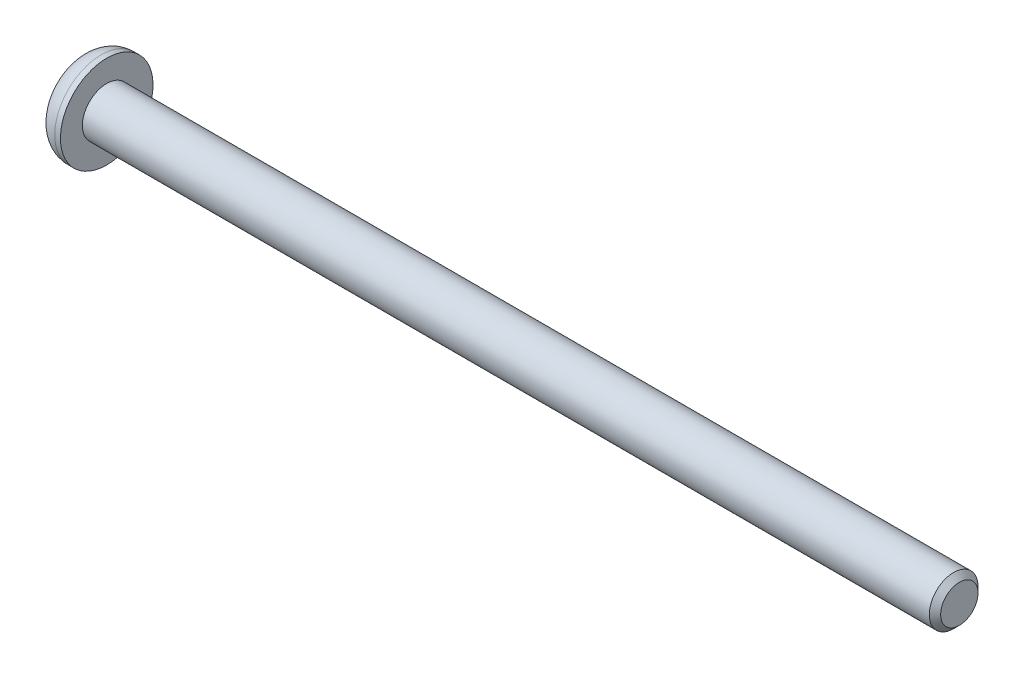
ISO-10303-21;
HEADER;
FILE_DESCRIPTION(('STEP AP214'),'2;1');
FILE_NAME('part.step','',(''),(''),'','','');
FILE_SCHEMA(('AUTOMOTIVE_DESIGN { 1 0 10303 214 1 1 1 1 }'));
ENDSEC;
DATA;
#1=APPLICATION_CONTEXT('core data for automotive mechanical design processes');
#2=APPLICATION_PROTOCOL_DEFINITION('international standard','automotive_design',2000,#1);
#3=PRODUCT_CONTEXT('',#1,'mechanical');
#4=PRODUCT('Part','Part','',(#3));
#5=PRODUCT_RELATED_PRODUCT_CATEGORY('part','',(#4));
#6=PRODUCT_DEFINITION_FORMATION('','',#4);
#7=PRODUCT_DEFINITION_CONTEXT('part definition',#1,'design');
#8=PRODUCT_DEFINITION('design','',#6,#7);
#9=PRODUCT_DEFINITION_SHAPE('','',#8);
#10=(LENGTH_UNIT() NAMED_UNIT(*) SI_UNIT(.MILLI.,.METRE.));
#11=(NAMED_UNIT(*) PLANE_ANGLE_UNIT() SI_UNIT($,.RADIAN.));
#12=(NAMED_UNIT(*) SI_UNIT($,.STERADIAN.) SOLID_ANGLE_UNIT());
#13=UNCERTAINTY_MEASURE_WITH_UNIT(LENGTH_MEASURE(1.E-05),#10,'distance_accuracy_value','');
#14=(GEOMETRIC_REPRESENTATION_CONTEXT(3) GLOBAL_UNCERTAINTY_ASSIGNED_CONTEXT((#13)) GLOBAL_UNIT_ASSIGNED_CONTEXT((#10,
#11,#12)) REPRESENTATION_CONTEXT('',''));
#15=CARTESIAN_POINT('',(0.,0.,0.));
#16=DIRECTION('',(0.,0.,1.));
#17=DIRECTION('',(1.,0.,0.));
#18=AXIS2_PLACEMENT_3D('',#15,#16,#17);
#19=CARTESIAN_POINT('',(0.,0.,0.));
#20=DIRECTION('',(1.,0.,0.));
#21=DIRECTION('',(0.,1.,0.));
#22=AXIS2_PLACEMENT_3D('',#19,#20,#21);
#23=PLANE('',#22);
#24=DIRECTION('',(0.,-0.5,-0.866025403784439));
#25=VECTOR('',#24,1.);
#26=CARTESIAN_POINT('',(0.,1.64544826719043,0.));
#27=LINE('',#26,#25);
#28=CARTESIAN_POINT('',(0.,1.64544826719043,0.));
#29=VERTEX_POINT('',#28);
#30=CARTESIAN_POINT('',(0.,0.822724133595217,-1.425));
#31=VERTEX_POINT('',#30);
#32=EDGE_CURVE('E138',#29,#31,#27,.T.);
#33=ORIENTED_EDGE('',*,*,#32,.F.);
#34=DIRECTION('',(0.,0.5,-0.866025403784439));
#35=VECTOR('',#34,1.);
#36=CARTESIAN_POINT('',(0.,0.822724133595217,1.425));
#37=LINE('',#36,#35);
#38=CARTESIAN_POINT('',(0.,0.822724133595217,1.425));
#39=VERTEX_POINT('',#38);
#40=EDGE_CURVE('E58',#39,#29,#37,.T.);
#41=ORIENTED_EDGE('',*,*,#40,.F.);
#42=DIRECTION('',(0.,1.,0.));
#43=VECTOR('',#42,1.);
#44=CARTESIAN_POINT('',(0.,-0.822724133595218,1.425));
#45=LINE('',#44,#43);
#46=CARTESIAN_POINT('',(0.,-0.822724133595218,1.425));
#47=VERTEX_POINT('',#46);
#48=EDGE_CURVE('E151',#47,#39,#45,.T.);
#49=ORIENTED_EDGE('',*,*,#48,.F.);
#50=DIRECTION('',(0.,0.5,0.866025403784439));
#51=VECTOR('',#50,1.);
#52=CARTESIAN_POINT('',(0.,-1.64544826719043,0.));
#53=LINE('',#52,#51);
#54=CARTESIAN_POINT('',(0.,-1.64544826719043,0.));
#55=VERTEX_POINT('',#54);
#56=EDGE_CURVE('E148',#55,#47,#53,.T.);
#57=ORIENTED_EDGE('',*,*,#56,.F.);
#58=DIRECTION('',(0.,-0.5,0.866025403784438));
#59=VECTOR('',#58,1.);
#60=CARTESIAN_POINT('',(0.,-0.822724133595217,-1.425));
#61=LINE('',#60,#59);
#62=CARTESIAN_POINT('',(0.,-0.822724133595217,-1.425));
#63=VERTEX_POINT('',#62);
#64=EDGE_CURVE('E106',#63,#55,#61,.T.);
#65=ORIENTED_EDGE('',*,*,#64,.F.);
#66=DIRECTION('',(0.,-1.,0.));
#67=VECTOR('',#66,1.);
#68=CARTESIAN_POINT('',(0.,0.822724133595217,-1.425));
#69=LINE('',#68,#67);
#70=EDGE_CURVE('E142',#31,#63,#69,.T.);
#71=ORIENTED_EDGE('',*,*,#70,.F.);
#72=EDGE_LOOP('',(#33,#41,#49,#57,#65,#71));
#73=FACE_BOUND('',#72,.T.);
#74=CARTESIAN_POINT('',(0.,0.,0.));
#75=DIRECTION('',(-1.,0.,0.));
#76=DIRECTION('',(0.,-1.,0.));
#77=AXIS2_PLACEMENT_3D('',#74,#75,#76);
#78=CIRCLE('',#77,2.85);
#79=CARTESIAN_POINT('',(0.,-2.85,0.));
#80=VERTEX_POINT('',#79);
#81=EDGE_CURVE('E157',#80,#80,#78,.T.);
#82=ORIENTED_EDGE('',*,*,#81,.T.);
#83=EDGE_LOOP('',(#82));
#84=FACE_BOUND('',#83,.T.);
#85=ADVANCED_FACE('F41',(#73,#84),#23,.F.);
#86=CARTESIAN_POINT('',(108.3,3.00000000000002,0.));
#87=DIRECTION('',(-1.,0.,0.));
#88=DIRECTION('',(0.,-1.,0.));
#89=AXIS2_PLACEMENT_3D('',#86,#87,#88);
#90=PLANE('',#89);
#91=CARTESIAN_POINT('',(108.3,0.,0.));
#92=DIRECTION('',(-1.,0.,0.));
#93=DIRECTION('',(0.,-1.,0.));
#94=AXIS2_PLACEMENT_3D('',#91,#92,#93);
#95=CIRCLE('',#94,2.29999999999998);
#96=CARTESIAN_POINT('',(108.3,-2.29999999999996,0.));
#97=VERTEX_POINT('',#96);
#98=EDGE_CURVE('E11',#97,#97,#95,.F.);
#99=ORIENTED_EDGE('',*,*,#98,.T.);
#100=EDGE_LOOP('',(#99));
#101=FACE_BOUND('',#100,.T.);
#102=ADVANCED_FACE('F203',(#101),#90,.F.);
#103=CARTESIAN_POINT('',(0.,0.,0.));
#104=DIRECTION('',(-1.,0.,0.));
#105=DIRECTION('',(0.,-1.,0.));
#106=AXIS2_PLACEMENT_3D('',#103,#104,#105);
#107=CYLINDRICAL_SURFACE('',#106,3.);
#108=CARTESIAN_POINT('',(107.6,0.,0.));
#109=DIRECTION('',(-1.,0.,0.));
#110=DIRECTION('',(0.,-1.,0.));
#111=AXIS2_PLACEMENT_3D('',#108,#109,#110);
#112=CIRCLE('',#111,3.);
#113=CARTESIAN_POINT('',(107.6,-2.99999999999998,0.));
#114=VERTEX_POINT('',#113);
#115=EDGE_CURVE('E51',#114,#114,#112,.T.);
#116=ORIENTED_EDGE('',*,*,#115,.T.);
#117=EDGE_LOOP('',(#116));
#118=FACE_BOUND('',#117,.T.);
#119=CARTESIAN_POINT('',(3.3,0.,0.));
#120=DIRECTION('',(-1.,0.,0.));
#121=DIRECTION('',(0.,-1.,0.));
#122=AXIS2_PLACEMENT_3D('',#119,#120,#121);
#123=CIRCLE('',#122,3.);
#124=CARTESIAN_POINT('',(3.3,-3.,0.));
#125=VERTEX_POINT('',#124);
#126=EDGE_CURVE('E178',#125,#125,#123,.T.);
#127=ORIENTED_EDGE('',*,*,#126,.F.);
#128=EDGE_LOOP('',(#127));
#129=FACE_BOUND('',#128,.T.);
#130=ADVANCED_FACE('F185',(#118,#129),#107,.T.);
#131=CARTESIAN_POINT('',(3.3,5.7,0.));
#132=DIRECTION('',(-1.,0.,0.));
#133=DIRECTION('',(0.,-1.,0.));
#134=AXIS2_PLACEMENT_3D('',#131,#132,#133);
#135=PLANE('',#134);
#136=CARTESIAN_POINT('',(3.3,0.,0.));
#137=DIRECTION('',(-1.,0.,0.));
#138=DIRECTION('',(0.,-1.,0.));
#139=AXIS2_PLACEMENT_3D('',#136,#137,#138);
#140=CIRCLE('',#139,5.7);
#141=CARTESIAN_POINT('',(3.3,-5.7,0.));
#142=VERTEX_POINT('',#141);
#143=EDGE_CURVE('E174',#142,#142,#140,.T.);
#144=ORIENTED_EDGE('',*,*,#143,.F.);
#145=EDGE_LOOP('',(#144));
#146=FACE_BOUND('',#145,.T.);
#147=ORIENTED_EDGE('',*,*,#126,.T.);
#148=EDGE_LOOP('',(#147));
#149=FACE_BOUND('',#148,.T.);
#150=ADVANCED_FACE('F215',(#146,#149),#135,.F.);
#151=CARTESIAN_POINT('',(0.,0.,0.));
#152=DIRECTION('',(-1.,0.,0.));
#153=DIRECTION('',(0.,-1.,0.));
#154=AXIS2_PLACEMENT_3D('',#151,#152,#153);
#155=CYLINDRICAL_SURFACE('',#154,5.7);
#156=CARTESIAN_POINT('',(2.6,0.,0.));
#157=DIRECTION('',(-1.,0.,0.));
#158=DIRECTION('',(0.,-1.,0.));
#159=AXIS2_PLACEMENT_3D('',#156,#157,#158);
#160=CIRCLE('',#159,5.7);
#161=CARTESIAN_POINT('',(2.6,-5.7,0.));
#162=VERTEX_POINT('',#161);
#163=EDGE_CURVE('E170',#162,#162,#160,.T.);
#164=ORIENTED_EDGE('',*,*,#163,.F.);
#165=EDGE_LOOP('',(#164));
#166=FACE_BOUND('',#165,.T.);
#167=ORIENTED_EDGE('',*,*,#143,.T.);
#168=EDGE_LOOP('',(#167));
#169=FACE_BOUND('',#168,.T.);
#170=ADVANCED_FACE('F198',(#166,#169),#155,.T.);
#171=CARTESIAN_POINT('',(2.6,0.,0.));
#172=DIRECTION('',(-1.,0.,0.));
#173=DIRECTION('',(0.,-1.,0.));
#174=AXIS2_PLACEMENT_3D('',#171,#172,#173);
#175=TOROIDAL_SURFACE('',#174,3.08903508771929,2.6109649122807);
#176=ORIENTED_EDGE('',*,*,#81,.F.);
#177=EDGE_LOOP('',(#176));
#178=FACE_BOUND('',#177,.T.);
#179=ORIENTED_EDGE('',*,*,#163,.T.);
#180=EDGE_LOOP('',(#179));
#181=FACE_BOUND('',#180,.T.);
#182=ADVANCED_FACE('F190',(#178,#181),#175,.T.);
#183=CARTESIAN_POINT('',(107.6,0.,0.));
#184=DIRECTION('',(-1.,0.,0.));
#185=DIRECTION('',(0.,-1.,0.));
#186=AXIS2_PLACEMENT_3D('',#183,#184,#185);
#187=CONICAL_SURFACE('',#186,3.,0.785398163397446);
#188=ORIENTED_EDGE('',*,*,#98,.F.);
#189=EDGE_LOOP('',(#188));
#190=FACE_BOUND('',#189,.T.);
#191=ORIENTED_EDGE('',*,*,#115,.F.);
#192=EDGE_LOOP('',(#191));
#193=FACE_BOUND('',#192,.T.);
#194=ADVANCED_FACE('F44',(#190,#193),#187,.T.);
#195=CARTESIAN_POINT('',(1.5,0.822724133595217,1.425));
#196=DIRECTION('',(0.,0.866025403784439,0.5));
#197=DIRECTION('',(0.,-0.5,0.866025403784439));
#198=AXIS2_PLACEMENT_3D('',#195,#196,#197);
#199=PLANE('',#198);
#200=ORIENTED_EDGE('',*,*,#40,.T.);
#201=DIRECTION('',(-1.,0.,0.));
#202=VECTOR('',#201,1.);
#203=CARTESIAN_POINT('',(1.5,1.64544826719043,0.));
#204=LINE('',#203,#202);
#205=CARTESIAN_POINT('',(1.5,1.64544826719043,0.));
#206=VERTEX_POINT('',#205);
#207=EDGE_CURVE('E88',#206,#29,#204,.T.);
#208=ORIENTED_EDGE('',*,*,#207,.F.);
#209=DIRECTION('',(0.,0.5,-0.866025403784439));
#210=VECTOR('',#209,1.);
#211=CARTESIAN_POINT('',(1.5,0.822724133595217,1.425));
#212=LINE('',#211,#210);
#213=CARTESIAN_POINT('',(1.5,0.822724133595217,1.425));
#214=VERTEX_POINT('',#213);
#215=EDGE_CURVE('E154',#214,#206,#212,.T.);
#216=ORIENTED_EDGE('',*,*,#215,.F.);
#217=DIRECTION('',(-1.,0.,0.));
#218=VECTOR('',#217,1.);
#219=CARTESIAN_POINT('',(1.5,0.822724133595217,1.425));
#220=LINE('',#219,#218);
#221=EDGE_CURVE('E66',#214,#39,#220,.T.);
#222=ORIENTED_EDGE('',*,*,#221,.T.);
#223=EDGE_LOOP('',(#200,#208,#216,#222));
#224=FACE_BOUND('',#223,.T.);
#225=ADVANCED_FACE('F189',(#224),#199,.F.);
#226=CARTESIAN_POINT('',(1.5,-0.822724133595217,1.425));
#227=DIRECTION('',(0.,0.,1.));
#228=DIRECTION('',(0.,-1.,0.));
#229=AXIS2_PLACEMENT_3D('',#226,#227,#228);
#230=PLANE('',#229);
#231=ORIENTED_EDGE('',*,*,#48,.T.);
#232=ORIENTED_EDGE('',*,*,#221,.F.);
#233=DIRECTION('',(0.,1.,0.));
#234=VECTOR('',#233,1.);
#235=CARTESIAN_POINT('',(1.5,-0.822724133595217,1.425));
#236=LINE('',#235,#234);
#237=CARTESIAN_POINT('',(1.5,-0.822724133595217,1.425));
#238=VERTEX_POINT('',#237);
#239=EDGE_CURVE('E120',#238,#214,#236,.T.);
#240=ORIENTED_EDGE('',*,*,#239,.F.);
#241=DIRECTION('',(-1.,0.,0.));
#242=VECTOR('',#241,1.);
#243=CARTESIAN_POINT('',(1.5,-0.822724133595217,1.425));
#244=LINE('',#243,#242);
#245=EDGE_CURVE('E111',#238,#47,#244,.T.);
#246=ORIENTED_EDGE('',*,*,#245,.T.);
#247=EDGE_LOOP('',(#231,#232,#240,#246));
#248=FACE_BOUND('',#247,.T.);
#249=ADVANCED_FACE('F196',(#248),#230,.F.);
#250=CARTESIAN_POINT('',(1.5,-1.64544826719043,0.));
#251=DIRECTION('',(0.,-0.866025403784439,0.5));
#252=DIRECTION('',(0.,-0.5,-0.866025403784439));
#253=AXIS2_PLACEMENT_3D('',#250,#251,#252);
#254=PLANE('',#253);
#255=ORIENTED_EDGE('',*,*,#56,.T.);
#256=ORIENTED_EDGE('',*,*,#245,.F.);
#257=DIRECTION('',(0.,0.5,0.866025403784439));
#258=VECTOR('',#257,1.);
#259=CARTESIAN_POINT('',(1.5,-1.64544826719043,0.));
#260=LINE('',#259,#258);
#261=CARTESIAN_POINT('',(1.5,-1.64544826719043,0.));
#262=VERTEX_POINT('',#261);
#263=EDGE_CURVE('E115',#262,#238,#260,.T.);
#264=ORIENTED_EDGE('',*,*,#263,.F.);
#265=DIRECTION('',(-1.,0.,0.));
#266=VECTOR('',#265,1.);
#267=CARTESIAN_POINT('',(1.5,-1.64544826719043,0.));
#268=LINE('',#267,#266);
#269=EDGE_CURVE('E99',#262,#55,#268,.T.);
#270=ORIENTED_EDGE('',*,*,#269,.T.);
#271=EDGE_LOOP('',(#255,#256,#264,#270));
#272=FACE_BOUND('',#271,.T.);
#273=ADVANCED_FACE('F116',(#272),#254,.F.);
#274=CARTESIAN_POINT('',(1.5,-0.822724133595217,-1.425));
#275=DIRECTION('',(0.,-0.866025403784439,-0.5));
#276=DIRECTION('',(0.,0.5,-0.866025403784439));
#277=AXIS2_PLACEMENT_3D('',#274,#275,#276);
#278=PLANE('',#277);
#279=ORIENTED_EDGE('',*,*,#64,.T.);
#280=ORIENTED_EDGE('',*,*,#269,.F.);
#281=DIRECTION('',(0.,-0.5,0.866025403784438));
#282=VECTOR('',#281,1.);
#283=CARTESIAN_POINT('',(1.5,-0.822724133595217,-1.425));
#284=LINE('',#283,#282);
#285=CARTESIAN_POINT('',(1.5,-0.822724133595217,-1.425));
#286=VERTEX_POINT('',#285);
#287=EDGE_CURVE('E103',#286,#262,#284,.T.);
#288=ORIENTED_EDGE('',*,*,#287,.F.);
#289=DIRECTION('',(-1.,0.,0.));
#290=VECTOR('',#289,1.);
#291=CARTESIAN_POINT('',(1.5,-0.822724133595217,-1.425));
#292=LINE('',#291,#290);
#293=EDGE_CURVE('E112',#286,#63,#292,.T.);
#294=ORIENTED_EDGE('',*,*,#293,.T.);
#295=EDGE_LOOP('',(#279,#280,#288,#294));
#296=FACE_BOUND('',#295,.T.);
#297=ADVANCED_FACE('F101',(#296),#278,.F.);
#298=CARTESIAN_POINT('',(1.5,0.822724133595218,-1.425));
#299=DIRECTION('',(0.,0.,-1.));
#300=DIRECTION('',(-1.,0.,0.));
#301=AXIS2_PLACEMENT_3D('',#298,#299,#300);
#302=PLANE('',#301);
#303=ORIENTED_EDGE('',*,*,#70,.T.);
#304=ORIENTED_EDGE('',*,*,#293,.F.);
#305=DIRECTION('',(0.,-1.,0.));
#306=VECTOR('',#305,1.);
#307=CARTESIAN_POINT('',(1.5,0.822724133595218,-1.425));
#308=LINE('',#307,#306);
#309=CARTESIAN_POINT('',(1.5,0.822724133595218,-1.425));
#310=VERTEX_POINT('',#309);
#311=EDGE_CURVE('E126',#310,#286,#308,.T.);
#312=ORIENTED_EDGE('',*,*,#311,.F.);
#313=DIRECTION('',(-1.,0.,0.));
#314=VECTOR('',#313,1.);
#315=CARTESIAN_POINT('',(1.5,0.822724133595218,-1.425));
#316=LINE('',#315,#314);
#317=EDGE_CURVE('E162',#310,#31,#316,.T.);
#318=ORIENTED_EDGE('',*,*,#317,.T.);
#319=EDGE_LOOP('',(#303,#304,#312,#318));
#320=FACE_BOUND('',#319,.T.);
#321=ADVANCED_FACE('F225',(#320),#302,.F.);
#322=CARTESIAN_POINT('',(1.5,1.64544826719043,0.));
#323=DIRECTION('',(0.,0.866025403784439,-0.5));
#324=DIRECTION('',(0.,0.5,0.866025403784439));
#325=AXIS2_PLACEMENT_3D('',#322,#323,#324);
#326=PLANE('',#325);
#327=ORIENTED_EDGE('',*,*,#32,.T.);
#328=ORIENTED_EDGE('',*,*,#317,.F.);
#329=DIRECTION('',(0.,-0.5,-0.866025403784439));
#330=VECTOR('',#329,1.);
#331=CARTESIAN_POINT('',(1.5,1.64544826719043,0.));
#332=LINE('',#331,#330);
#333=EDGE_CURVE('E130',#206,#310,#332,.T.);
#334=ORIENTED_EDGE('',*,*,#333,.F.);
#335=ORIENTED_EDGE('',*,*,#207,.T.);
#336=EDGE_LOOP('',(#327,#328,#334,#335));
#337=FACE_BOUND('',#336,.T.);
#338=ADVANCED_FACE('F222',(#337),#326,.F.);
#339=CARTESIAN_POINT('',(1.5,0.,0.));
#340=DIRECTION('',(-1.,0.,0.));
#341=DIRECTION('',(0.,-1.,0.));
#342=AXIS2_PLACEMENT_3D('',#339,#340,#341);
#343=PLANE('',#342);
#344=ORIENTED_EDGE('',*,*,#215,.T.);
#345=ORIENTED_EDGE('',*,*,#333,.T.);
#346=ORIENTED_EDGE('',*,*,#311,.T.);
#347=ORIENTED_EDGE('',*,*,#287,.T.);
#348=ORIENTED_EDGE('',*,*,#263,.T.);
#349=ORIENTED_EDGE('',*,*,#239,.T.);
#350=EDGE_LOOP('',(#344,#345,#346,#347,#348,#349));
#351=FACE_BOUND('',#350,.T.);
#352=ADVANCED_FACE('F123',(#351),#343,.T.);
#353=CLOSED_SHELL('',(#85,#102,#130,#150,#170,#182,#194,#225,#249,#273,#297,#321,#338,#352));
#354=MANIFOLD_SOLID_BREP('B2',#353);
#355=ADVANCED_BREP_SHAPE_REPRESENTATION('',(#18,#354),#14);
#356=SHAPE_DEFINITION_REPRESENTATION(#9,#355);
ENDSEC;
END-ISO-10303-21;
